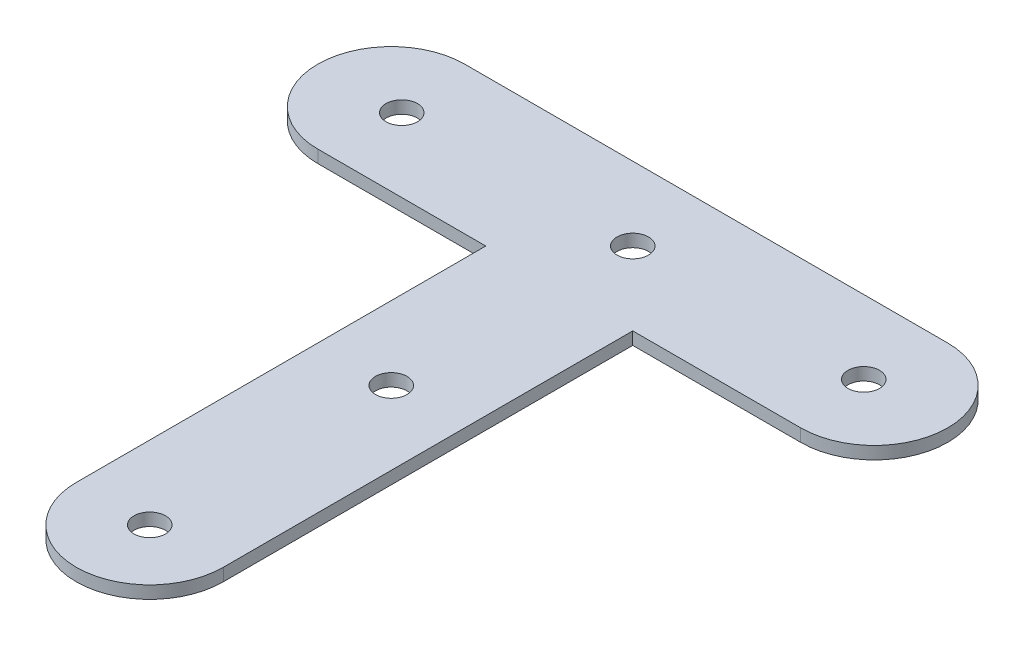
ISO-10303-21;
HEADER;
FILE_DESCRIPTION(('STEP AP214'),'2;1');
FILE_NAME('part.step','',(''),(''),'','','');
FILE_SCHEMA(('AUTOMOTIVE_DESIGN { 1 0 10303 214 1 1 1 1 }'));
ENDSEC;
DATA;
#1=APPLICATION_CONTEXT('core data for automotive mechanical design processes');
#2=APPLICATION_PROTOCOL_DEFINITION('international standard','automotive_design',2000,#1);
#3=PRODUCT_CONTEXT('',#1,'mechanical');
#4=PRODUCT('Part','Part','',(#3));
#5=PRODUCT_RELATED_PRODUCT_CATEGORY('part','',(#4));
#6=PRODUCT_DEFINITION_FORMATION('','',#4);
#7=PRODUCT_DEFINITION_CONTEXT('part definition',#1,'design');
#8=PRODUCT_DEFINITION('design','',#6,#7);
#9=PRODUCT_DEFINITION_SHAPE('','',#8);
#10=(LENGTH_UNIT() NAMED_UNIT(*) SI_UNIT(.MILLI.,.METRE.));
#11=(NAMED_UNIT(*) PLANE_ANGLE_UNIT() SI_UNIT($,.RADIAN.));
#12=(NAMED_UNIT(*) SI_UNIT($,.STERADIAN.) SOLID_ANGLE_UNIT());
#13=UNCERTAINTY_MEASURE_WITH_UNIT(LENGTH_MEASURE(1.E-05),#10,'distance_accuracy_value','');
#14=(GEOMETRIC_REPRESENTATION_CONTEXT(3) GLOBAL_UNCERTAINTY_ASSIGNED_CONTEXT((#13)) GLOBAL_UNIT_ASSIGNED_CONTEXT((#10,
#11,#12)) REPRESENTATION_CONTEXT('',''));
#15=CARTESIAN_POINT('',(0.,0.,0.));
#16=DIRECTION('',(0.,0.,1.));
#17=DIRECTION('',(1.,0.,0.));
#18=AXIS2_PLACEMENT_3D('',#15,#16,#17);
#19=CARTESIAN_POINT('',(23.,1.2,0.));
#20=DIRECTION('',(0.,1.,0.));
#21=DIRECTION('',(0.,0.,1.));
#22=AXIS2_PLACEMENT_3D('',#19,#20,#21);
#23=PLANE('',#22);
#24=CARTESIAN_POINT('',(0.,1.2,23.));
#25=DIRECTION('',(0.,1.,0.));
#26=DIRECTION('',(0.,0.,1.));
#27=AXIS2_PLACEMENT_3D('',#24,#25,#26);
#28=CIRCLE('',#27,1.5);
#29=CARTESIAN_POINT('',(0.,1.2,24.5));
#30=VERTEX_POINT('',#29);
#31=EDGE_CURVE('E196',#30,#30,#28,.T.);
#32=ORIENTED_EDGE('',*,*,#31,.F.);
#33=EDGE_LOOP('',(#32));
#34=FACE_BOUND('',#33,.T.);
#35=CARTESIAN_POINT('',(0.,1.2,0.));
#36=DIRECTION('',(0.,1.,0.));
#37=DIRECTION('',(0.,0.,1.));
#38=AXIS2_PLACEMENT_3D('',#35,#36,#37);
#39=CIRCLE('',#38,1.5);
#40=CARTESIAN_POINT('',(0.,1.2,1.5));
#41=VERTEX_POINT('',#40);
#42=EDGE_CURVE('E184',#41,#41,#39,.T.);
#43=ORIENTED_EDGE('',*,*,#42,.F.);
#44=EDGE_LOOP('',(#43));
#45=FACE_BOUND('',#44,.T.);
#46=CARTESIAN_POINT('',(23.,1.2,0.));
#47=DIRECTION('',(0.,1.,0.));
#48=DIRECTION('',(0.,0.,1.));
#49=AXIS2_PLACEMENT_3D('',#46,#47,#48);
#50=CIRCLE('',#49,6.99999999999999);
#51=CARTESIAN_POINT('',(23.,1.2,6.99999999999999));
#52=VERTEX_POINT('',#51);
#53=CARTESIAN_POINT('',(23.,1.2,-6.99999999999999));
#54=VERTEX_POINT('',#53);
#55=EDGE_CURVE('E147',#52,#54,#50,.T.);
#56=ORIENTED_EDGE('',*,*,#55,.T.);
#57=DIRECTION('',(-1.,0.,0.));
#58=VECTOR('',#57,1.);
#59=CARTESIAN_POINT('',(-23.,1.2,-7.));
#60=LINE('',#59,#58);
#61=CARTESIAN_POINT('',(-23.,1.2,-6.99999999999999));
#62=VERTEX_POINT('',#61);
#63=EDGE_CURVE('E95',#54,#62,#60,.T.);
#64=ORIENTED_EDGE('',*,*,#63,.T.);
#65=CARTESIAN_POINT('',(-23.,1.2,0.));
#66=DIRECTION('',(0.,1.,0.));
#67=DIRECTION('',(0.,0.,-1.));
#68=AXIS2_PLACEMENT_3D('',#65,#66,#67);
#69=CIRCLE('',#68,7.);
#70=CARTESIAN_POINT('',(-23.,1.2,7.));
#71=VERTEX_POINT('',#70);
#72=EDGE_CURVE('E162',#62,#71,#69,.T.);
#73=ORIENTED_EDGE('',*,*,#72,.T.);
#74=DIRECTION('',(1.,0.,0.));
#75=VECTOR('',#74,1.);
#76=CARTESIAN_POINT('',(-7.,1.2,7.));
#77=LINE('',#76,#75);
#78=CARTESIAN_POINT('',(-7.,1.2,7.));
#79=VERTEX_POINT('',#78);
#80=EDGE_CURVE('E175',#71,#79,#77,.T.);
#81=ORIENTED_EDGE('',*,*,#80,.T.);
#82=DIRECTION('',(0.,0.,1.));
#83=VECTOR('',#82,1.);
#84=CARTESIAN_POINT('',(-6.99999999999999,1.2,46.));
#85=LINE('',#84,#83);
#86=CARTESIAN_POINT('',(-6.99999999999999,1.2,46.));
#87=VERTEX_POINT('',#86);
#88=EDGE_CURVE('E114',#79,#87,#85,.T.);
#89=ORIENTED_EDGE('',*,*,#88,.T.);
#90=CARTESIAN_POINT('',(0.,1.2,46.));
#91=DIRECTION('',(0.,1.,0.));
#92=DIRECTION('',(0.,0.,-1.));
#93=AXIS2_PLACEMENT_3D('',#90,#91,#92);
#94=CIRCLE('',#93,7.);
#95=CARTESIAN_POINT('',(7.,1.2,46.));
#96=VERTEX_POINT('',#95);
#97=EDGE_CURVE('E108',#87,#96,#94,.T.);
#98=ORIENTED_EDGE('',*,*,#97,.T.);
#99=DIRECTION('',(0.,0.,-1.));
#100=VECTOR('',#99,1.);
#101=CARTESIAN_POINT('',(7.,1.2,7.));
#102=LINE('',#101,#100);
#103=CARTESIAN_POINT('',(7.,1.2,7.));
#104=VERTEX_POINT('',#103);
#105=EDGE_CURVE('E112',#96,#104,#102,.T.);
#106=ORIENTED_EDGE('',*,*,#105,.T.);
#107=DIRECTION('',(1.,0.,0.));
#108=VECTOR('',#107,1.);
#109=CARTESIAN_POINT('',(23.,1.2,6.99999999999999));
#110=LINE('',#109,#108);
#111=EDGE_CURVE('E52',#104,#52,#110,.T.);
#112=ORIENTED_EDGE('',*,*,#111,.T.);
#113=EDGE_LOOP('',(#56,#64,#73,#81,#89,#98,#106,#112));
#114=FACE_BOUND('',#113,.T.);
#115=CARTESIAN_POINT('',(-22.,1.2,0.));
#116=DIRECTION('',(0.,1.,0.));
#117=DIRECTION('',(0.,0.,1.));
#118=AXIS2_PLACEMENT_3D('',#115,#116,#117);
#119=CIRCLE('',#118,1.5);
#120=CARTESIAN_POINT('',(-22.,1.2,1.5));
#121=VERTEX_POINT('',#120);
#122=EDGE_CURVE('E136',#121,#121,#119,.T.);
#123=ORIENTED_EDGE('',*,*,#122,.F.);
#124=EDGE_LOOP('',(#123));
#125=FACE_BOUND('',#124,.T.);
#126=CARTESIAN_POINT('',(22.,1.2,0.));
#127=DIRECTION('',(0.,1.,0.));
#128=DIRECTION('',(0.,0.,1.));
#129=AXIS2_PLACEMENT_3D('',#126,#127,#128);
#130=CIRCLE('',#129,1.5);
#131=CARTESIAN_POINT('',(22.,1.2,1.5));
#132=VERTEX_POINT('',#131);
#133=EDGE_CURVE('E190',#132,#132,#130,.T.);
#134=ORIENTED_EDGE('',*,*,#133,.F.);
#135=EDGE_LOOP('',(#134));
#136=FACE_BOUND('',#135,.T.);
#137=CARTESIAN_POINT('',(0.,1.2,46.));
#138=DIRECTION('',(0.,1.,0.));
#139=DIRECTION('',(0.,0.,1.));
#140=AXIS2_PLACEMENT_3D('',#137,#138,#139);
#141=CIRCLE('',#140,1.5);
#142=CARTESIAN_POINT('',(0.,1.2,47.5));
#143=VERTEX_POINT('',#142);
#144=EDGE_CURVE('E202',#143,#143,#141,.T.);
#145=ORIENTED_EDGE('',*,*,#144,.F.);
#146=EDGE_LOOP('',(#145));
#147=FACE_BOUND('',#146,.T.);
#148=ADVANCED_FACE('F35',(#34,#45,#114,#125,#136,#147),#23,.T.);
#149=CARTESIAN_POINT('',(23.,0.,0.));
#150=DIRECTION('',(0.,1.,0.));
#151=DIRECTION('',(0.,0.,1.));
#152=AXIS2_PLACEMENT_3D('',#149,#150,#151);
#153=PLANE('',#152);
#154=CARTESIAN_POINT('',(23.,0.,0.));
#155=DIRECTION('',(0.,1.,0.));
#156=DIRECTION('',(0.,0.,1.));
#157=AXIS2_PLACEMENT_3D('',#154,#155,#156);
#158=CIRCLE('',#157,6.99999999999999);
#159=CARTESIAN_POINT('',(23.,0.,6.99999999999999));
#160=VERTEX_POINT('',#159);
#161=CARTESIAN_POINT('',(23.,0.,-6.99999999999999));
#162=VERTEX_POINT('',#161);
#163=EDGE_CURVE('E132',#160,#162,#158,.T.);
#164=ORIENTED_EDGE('',*,*,#163,.F.);
#165=DIRECTION('',(1.,0.,0.));
#166=VECTOR('',#165,1.);
#167=CARTESIAN_POINT('',(23.,0.,6.99999999999999));
#168=LINE('',#167,#166);
#169=CARTESIAN_POINT('',(7.,0.,7.));
#170=VERTEX_POINT('',#169);
#171=EDGE_CURVE('E87',#170,#160,#168,.T.);
#172=ORIENTED_EDGE('',*,*,#171,.F.);
#173=DIRECTION('',(0.,0.,-1.));
#174=VECTOR('',#173,1.);
#175=CARTESIAN_POINT('',(7.,0.,7.));
#176=LINE('',#175,#174);
#177=CARTESIAN_POINT('',(7.,0.,46.));
#178=VERTEX_POINT('',#177);
#179=EDGE_CURVE('E81',#178,#170,#176,.T.);
#180=ORIENTED_EDGE('',*,*,#179,.F.);
#181=CARTESIAN_POINT('',(0.,0.,46.));
#182=DIRECTION('',(0.,1.,0.));
#183=DIRECTION('',(0.,0.,-1.));
#184=AXIS2_PLACEMENT_3D('',#181,#182,#183);
#185=CIRCLE('',#184,7.);
#186=CARTESIAN_POINT('',(-6.99999999999999,0.,46.));
#187=VERTEX_POINT('',#186);
#188=EDGE_CURVE('E122',#187,#178,#185,.T.);
#189=ORIENTED_EDGE('',*,*,#188,.F.);
#190=DIRECTION('',(0.,0.,1.));
#191=VECTOR('',#190,1.);
#192=CARTESIAN_POINT('',(-6.99999999999999,0.,46.));
#193=LINE('',#192,#191);
#194=CARTESIAN_POINT('',(-7.,0.,7.));
#195=VERTEX_POINT('',#194);
#196=EDGE_CURVE('E142',#195,#187,#193,.T.);
#197=ORIENTED_EDGE('',*,*,#196,.F.);
#198=DIRECTION('',(1.,0.,0.));
#199=VECTOR('',#198,1.);
#200=CARTESIAN_POINT('',(-7.,0.,7.));
#201=LINE('',#200,#199);
#202=CARTESIAN_POINT('',(-23.,0.,7.));
#203=VERTEX_POINT('',#202);
#204=EDGE_CURVE('E140',#203,#195,#201,.T.);
#205=ORIENTED_EDGE('',*,*,#204,.F.);
#206=CARTESIAN_POINT('',(-23.,0.,0.));
#207=DIRECTION('',(0.,1.,0.));
#208=DIRECTION('',(0.,0.,-1.));
#209=AXIS2_PLACEMENT_3D('',#206,#207,#208);
#210=CIRCLE('',#209,7.);
#211=CARTESIAN_POINT('',(-23.,0.,-6.99999999999999));
#212=VERTEX_POINT('',#211);
#213=EDGE_CURVE('E138',#212,#203,#210,.T.);
#214=ORIENTED_EDGE('',*,*,#213,.F.);
#215=DIRECTION('',(-1.,0.,0.));
#216=VECTOR('',#215,1.);
#217=CARTESIAN_POINT('',(-23.,0.,-7.));
#218=LINE('',#217,#216);
#219=EDGE_CURVE('E135',#162,#212,#218,.T.);
#220=ORIENTED_EDGE('',*,*,#219,.F.);
#221=EDGE_LOOP('',(#164,#172,#180,#189,#197,#205,#214,#220));
#222=FACE_BOUND('',#221,.T.);
#223=CARTESIAN_POINT('',(-22.,0.,0.));
#224=DIRECTION('',(0.,1.,0.));
#225=DIRECTION('',(0.,0.,1.));
#226=AXIS2_PLACEMENT_3D('',#223,#224,#225);
#227=CIRCLE('',#226,1.5);
#228=CARTESIAN_POINT('',(-22.,0.,1.5));
#229=VERTEX_POINT('',#228);
#230=EDGE_CURVE('E181',#229,#229,#227,.T.);
#231=ORIENTED_EDGE('',*,*,#230,.T.);
#232=EDGE_LOOP('',(#231));
#233=FACE_BOUND('',#232,.T.);
#234=CARTESIAN_POINT('',(0.,0.,0.));
#235=DIRECTION('',(0.,1.,0.));
#236=DIRECTION('',(0.,0.,1.));
#237=AXIS2_PLACEMENT_3D('',#234,#235,#236);
#238=CIRCLE('',#237,1.5);
#239=CARTESIAN_POINT('',(0.,0.,1.5));
#240=VERTEX_POINT('',#239);
#241=EDGE_CURVE('E187',#240,#240,#238,.T.);
#242=ORIENTED_EDGE('',*,*,#241,.T.);
#243=EDGE_LOOP('',(#242));
#244=FACE_BOUND('',#243,.T.);
#245=CARTESIAN_POINT('',(22.,0.,0.));
#246=DIRECTION('',(0.,1.,0.));
#247=DIRECTION('',(0.,0.,1.));
#248=AXIS2_PLACEMENT_3D('',#245,#246,#247);
#249=CIRCLE('',#248,1.5);
#250=CARTESIAN_POINT('',(22.,0.,1.5));
#251=VERTEX_POINT('',#250);
#252=EDGE_CURVE('E193',#251,#251,#249,.T.);
#253=ORIENTED_EDGE('',*,*,#252,.T.);
#254=EDGE_LOOP('',(#253));
#255=FACE_BOUND('',#254,.T.);
#256=CARTESIAN_POINT('',(0.,0.,23.));
#257=DIRECTION('',(0.,1.,0.));
#258=DIRECTION('',(0.,0.,1.));
#259=AXIS2_PLACEMENT_3D('',#256,#257,#258);
#260=CIRCLE('',#259,1.5);
#261=CARTESIAN_POINT('',(0.,0.,24.5));
#262=VERTEX_POINT('',#261);
#263=EDGE_CURVE('E199',#262,#262,#260,.T.);
#264=ORIENTED_EDGE('',*,*,#263,.T.);
#265=EDGE_LOOP('',(#264));
#266=FACE_BOUND('',#265,.T.);
#267=CARTESIAN_POINT('',(0.,0.,46.));
#268=DIRECTION('',(0.,1.,0.));
#269=DIRECTION('',(0.,0.,1.));
#270=AXIS2_PLACEMENT_3D('',#267,#268,#269);
#271=CIRCLE('',#270,1.5);
#272=CARTESIAN_POINT('',(0.,0.,47.5));
#273=VERTEX_POINT('',#272);
#274=EDGE_CURVE('E205',#273,#273,#271,.T.);
#275=ORIENTED_EDGE('',*,*,#274,.T.);
#276=EDGE_LOOP('',(#275));
#277=FACE_BOUND('',#276,.T.);
#278=ADVANCED_FACE('F166',(#222,#233,#244,#255,#266,#277),#153,.F.);
#279=CARTESIAN_POINT('',(23.,1.2,0.));
#280=DIRECTION('',(0.,-1.,0.));
#281=DIRECTION('',(0.,0.,-1.));
#282=AXIS2_PLACEMENT_3D('',#279,#280,#281);
#283=CYLINDRICAL_SURFACE('',#282,6.99999999999999);
#284=ORIENTED_EDGE('',*,*,#163,.T.);
#285=DIRECTION('',(0.,-1.,0.));
#286=VECTOR('',#285,1.);
#287=CARTESIAN_POINT('',(23.,1.2,-6.99999999999999));
#288=LINE('',#287,#286);
#289=EDGE_CURVE('E11',#54,#162,#288,.T.);
#290=ORIENTED_EDGE('',*,*,#289,.F.);
#291=ORIENTED_EDGE('',*,*,#55,.F.);
#292=DIRECTION('',(0.,-1.,0.));
#293=VECTOR('',#292,1.);
#294=CARTESIAN_POINT('',(23.,1.2,6.99999999999999));
#295=LINE('',#294,#293);
#296=EDGE_CURVE('E128',#52,#160,#295,.T.);
#297=ORIENTED_EDGE('',*,*,#296,.T.);
#298=EDGE_LOOP('',(#284,#290,#291,#297));
#299=FACE_BOUND('',#298,.T.);
#300=ADVANCED_FACE('F37',(#299),#283,.T.);
#301=CARTESIAN_POINT('',(-23.,1.2,-7.));
#302=DIRECTION('',(0.,0.,1.));
#303=DIRECTION('',(1.,0.,0.));
#304=AXIS2_PLACEMENT_3D('',#301,#302,#303);
#305=PLANE('',#304);
#306=ORIENTED_EDGE('',*,*,#219,.T.);
#307=DIRECTION('',(0.,-1.,0.));
#308=VECTOR('',#307,1.);
#309=CARTESIAN_POINT('',(-23.,1.2,-6.99999999999999));
#310=LINE('',#309,#308);
#311=EDGE_CURVE('E44',#62,#212,#310,.T.);
#312=ORIENTED_EDGE('',*,*,#311,.F.);
#313=ORIENTED_EDGE('',*,*,#63,.F.);
#314=ORIENTED_EDGE('',*,*,#289,.T.);
#315=EDGE_LOOP('',(#306,#312,#313,#314));
#316=FACE_BOUND('',#315,.T.);
#317=ADVANCED_FACE('F239',(#316),#305,.F.);
#318=CARTESIAN_POINT('',(-23.,1.2,0.));
#319=DIRECTION('',(0.,-1.,0.));
#320=DIRECTION('',(0.,0.,-1.));
#321=AXIS2_PLACEMENT_3D('',#318,#319,#320);
#322=CYLINDRICAL_SURFACE('',#321,7.);
#323=ORIENTED_EDGE('',*,*,#213,.T.);
#324=DIRECTION('',(0.,-1.,0.));
#325=VECTOR('',#324,1.);
#326=CARTESIAN_POINT('',(-23.,1.2,7.));
#327=LINE('',#326,#325);
#328=EDGE_CURVE('E154',#71,#203,#327,.T.);
#329=ORIENTED_EDGE('',*,*,#328,.F.);
#330=ORIENTED_EDGE('',*,*,#72,.F.);
#331=ORIENTED_EDGE('',*,*,#311,.T.);
#332=EDGE_LOOP('',(#323,#329,#330,#331));
#333=FACE_BOUND('',#332,.T.);
#334=ADVANCED_FACE('F160',(#333),#322,.T.);
#335=CARTESIAN_POINT('',(-7.,1.2,7.));
#336=DIRECTION('',(0.,0.,-1.));
#337=DIRECTION('',(-1.,0.,0.));
#338=AXIS2_PLACEMENT_3D('',#335,#336,#337);
#339=PLANE('',#338);
#340=ORIENTED_EDGE('',*,*,#204,.T.);
#341=DIRECTION('',(0.,-1.,0.));
#342=VECTOR('',#341,1.);
#343=CARTESIAN_POINT('',(-7.,1.2,7.));
#344=LINE('',#343,#342);
#345=EDGE_CURVE('E151',#79,#195,#344,.T.);
#346=ORIENTED_EDGE('',*,*,#345,.F.);
#347=ORIENTED_EDGE('',*,*,#80,.F.);
#348=ORIENTED_EDGE('',*,*,#328,.T.);
#349=EDGE_LOOP('',(#340,#346,#347,#348));
#350=FACE_BOUND('',#349,.T.);
#351=ADVANCED_FACE('F171',(#350),#339,.F.);
#352=CARTESIAN_POINT('',(-6.99999999999999,1.2,46.));
#353=DIRECTION('',(1.,0.,0.));
#354=DIRECTION('',(0.,0.,-1.));
#355=AXIS2_PLACEMENT_3D('',#352,#353,#354);
#356=PLANE('',#355);
#357=ORIENTED_EDGE('',*,*,#196,.T.);
#358=DIRECTION('',(0.,-1.,0.));
#359=VECTOR('',#358,1.);
#360=CARTESIAN_POINT('',(-6.99999999999999,1.2,46.));
#361=LINE('',#360,#359);
#362=EDGE_CURVE('E123',#87,#187,#361,.T.);
#363=ORIENTED_EDGE('',*,*,#362,.F.);
#364=ORIENTED_EDGE('',*,*,#88,.F.);
#365=ORIENTED_EDGE('',*,*,#345,.T.);
#366=EDGE_LOOP('',(#357,#363,#364,#365));
#367=FACE_BOUND('',#366,.T.);
#368=ADVANCED_FACE('F174',(#367),#356,.F.);
#369=CARTESIAN_POINT('',(0.,1.2,46.));
#370=DIRECTION('',(0.,-1.,0.));
#371=DIRECTION('',(0.,0.,-1.));
#372=AXIS2_PLACEMENT_3D('',#369,#370,#371);
#373=CYLINDRICAL_SURFACE('',#372,7.);
#374=ORIENTED_EDGE('',*,*,#188,.T.);
#375=DIRECTION('',(0.,-1.,0.));
#376=VECTOR('',#375,1.);
#377=CARTESIAN_POINT('',(7.,1.2,46.));
#378=LINE('',#377,#376);
#379=EDGE_CURVE('E119',#96,#178,#378,.T.);
#380=ORIENTED_EDGE('',*,*,#379,.F.);
#381=ORIENTED_EDGE('',*,*,#97,.F.);
#382=ORIENTED_EDGE('',*,*,#362,.T.);
#383=EDGE_LOOP('',(#374,#380,#381,#382));
#384=FACE_BOUND('',#383,.T.);
#385=ADVANCED_FACE('F120',(#384),#373,.T.);
#386=CARTESIAN_POINT('',(7.,1.2,7.));
#387=DIRECTION('',(-1.,0.,0.));
#388=DIRECTION('',(0.,0.,1.));
#389=AXIS2_PLACEMENT_3D('',#386,#387,#388);
#390=PLANE('',#389);
#391=ORIENTED_EDGE('',*,*,#179,.T.);
#392=DIRECTION('',(0.,-1.,0.));
#393=VECTOR('',#392,1.);
#394=CARTESIAN_POINT('',(7.,1.2,7.));
#395=LINE('',#394,#393);
#396=EDGE_CURVE('E124',#104,#170,#395,.T.);
#397=ORIENTED_EDGE('',*,*,#396,.F.);
#398=ORIENTED_EDGE('',*,*,#105,.F.);
#399=ORIENTED_EDGE('',*,*,#379,.T.);
#400=EDGE_LOOP('',(#391,#397,#398,#399));
#401=FACE_BOUND('',#400,.T.);
#402=ADVANCED_FACE('F126',(#401),#390,.F.);
#403=CARTESIAN_POINT('',(23.,1.2,6.99999999999999));
#404=DIRECTION('',(0.,0.,-1.));
#405=DIRECTION('',(-1.,0.,0.));
#406=AXIS2_PLACEMENT_3D('',#403,#404,#405);
#407=PLANE('',#406);
#408=ORIENTED_EDGE('',*,*,#171,.T.);
#409=ORIENTED_EDGE('',*,*,#296,.F.);
#410=ORIENTED_EDGE('',*,*,#111,.F.);
#411=ORIENTED_EDGE('',*,*,#396,.T.);
#412=EDGE_LOOP('',(#408,#409,#410,#411));
#413=FACE_BOUND('',#412,.T.);
#414=ADVANCED_FACE('F227',(#413),#407,.F.);
#415=CARTESIAN_POINT('',(-22.,1.2,0.));
#416=DIRECTION('',(0.,-1.,0.));
#417=DIRECTION('',(0.,0.,-1.));
#418=AXIS2_PLACEMENT_3D('',#415,#416,#417);
#419=CYLINDRICAL_SURFACE('',#418,1.5);
#420=ORIENTED_EDGE('',*,*,#122,.T.);
#421=EDGE_LOOP('',(#420));
#422=FACE_BOUND('',#421,.T.);
#423=ORIENTED_EDGE('',*,*,#230,.F.);
#424=EDGE_LOOP('',(#423));
#425=FACE_BOUND('',#424,.T.);
#426=ADVANCED_FACE('F224',(#422,#425),#419,.F.);
#427=CARTESIAN_POINT('',(0.,1.2,0.));
#428=DIRECTION('',(0.,-1.,0.));
#429=DIRECTION('',(0.,0.,-1.));
#430=AXIS2_PLACEMENT_3D('',#427,#428,#429);
#431=CYLINDRICAL_SURFACE('',#430,1.5);
#432=ORIENTED_EDGE('',*,*,#42,.T.);
#433=EDGE_LOOP('',(#432));
#434=FACE_BOUND('',#433,.T.);
#435=ORIENTED_EDGE('',*,*,#241,.F.);
#436=EDGE_LOOP('',(#435));
#437=FACE_BOUND('',#436,.T.);
#438=ADVANCED_FACE('F303',(#434,#437),#431,.F.);
#439=CARTESIAN_POINT('',(22.,1.2,0.));
#440=DIRECTION('',(0.,-1.,0.));
#441=DIRECTION('',(0.,0.,-1.));
#442=AXIS2_PLACEMENT_3D('',#439,#440,#441);
#443=CYLINDRICAL_SURFACE('',#442,1.5);
#444=ORIENTED_EDGE('',*,*,#133,.T.);
#445=EDGE_LOOP('',(#444));
#446=FACE_BOUND('',#445,.T.);
#447=ORIENTED_EDGE('',*,*,#252,.F.);
#448=EDGE_LOOP('',(#447));
#449=FACE_BOUND('',#448,.T.);
#450=ADVANCED_FACE('F311',(#446,#449),#443,.F.);
#451=CARTESIAN_POINT('',(0.,1.2,23.));
#452=DIRECTION('',(0.,-1.,0.));
#453=DIRECTION('',(0.,0.,-1.));
#454=AXIS2_PLACEMENT_3D('',#451,#452,#453);
#455=CYLINDRICAL_SURFACE('',#454,1.5);
#456=ORIENTED_EDGE('',*,*,#31,.T.);
#457=EDGE_LOOP('',(#456));
#458=FACE_BOUND('',#457,.T.);
#459=ORIENTED_EDGE('',*,*,#263,.F.);
#460=EDGE_LOOP('',(#459));
#461=FACE_BOUND('',#460,.T.);
#462=ADVANCED_FACE('F319',(#458,#461),#455,.F.);
#463=CARTESIAN_POINT('',(0.,1.2,46.));
#464=DIRECTION('',(0.,-1.,0.));
#465=DIRECTION('',(0.,0.,-1.));
#466=AXIS2_PLACEMENT_3D('',#463,#464,#465);
#467=CYLINDRICAL_SURFACE('',#466,1.5);
#468=ORIENTED_EDGE('',*,*,#144,.T.);
#469=EDGE_LOOP('',(#468));
#470=FACE_BOUND('',#469,.T.);
#471=ORIENTED_EDGE('',*,*,#274,.F.);
#472=EDGE_LOOP('',(#471));
#473=FACE_BOUND('',#472,.T.);
#474=ADVANCED_FACE('F211',(#470,#473),#467,.F.);
#475=CLOSED_SHELL('',(#148,#278,#300,#317,#334,#351,#368,#385,#402,#414,#426,#438,#450,#462,#474));
#476=MANIFOLD_SOLID_BREP('B2',#475);
#477=ADVANCED_BREP_SHAPE_REPRESENTATION('',(#18,#476),#14);
#478=SHAPE_DEFINITION_REPRESENTATION(#9,#477);
ENDSEC;
END-ISO-10303-21;
